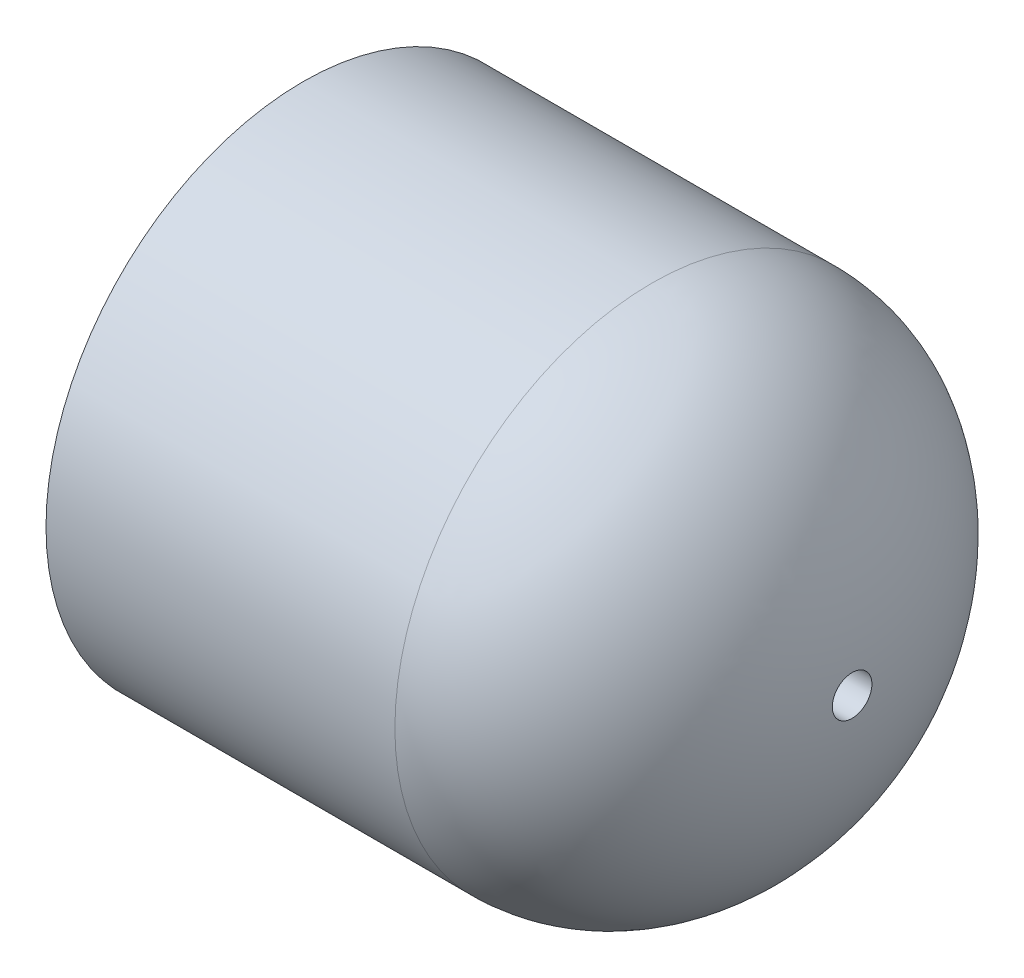
ISO-10303-21;
HEADER;
FILE_DESCRIPTION(('STEP AP214'),'2;1');
FILE_NAME('part.step','',(''),(''),'','','');
FILE_SCHEMA(('AUTOMOTIVE_DESIGN { 1 0 10303 214 1 1 1 1 }'));
ENDSEC;
DATA;
#1=APPLICATION_CONTEXT('core data for automotive mechanical design processes');
#2=APPLICATION_PROTOCOL_DEFINITION('international standard','automotive_design',2000,#1);
#3=PRODUCT_CONTEXT('',#1,'mechanical');
#4=PRODUCT('Part','Part','',(#3));
#5=PRODUCT_RELATED_PRODUCT_CATEGORY('part','',(#4));
#6=PRODUCT_DEFINITION_FORMATION('','',#4);
#7=PRODUCT_DEFINITION_CONTEXT('part definition',#1,'design');
#8=PRODUCT_DEFINITION('design','',#6,#7);
#9=PRODUCT_DEFINITION_SHAPE('','',#8);
#10=(LENGTH_UNIT() NAMED_UNIT(*) SI_UNIT(.MILLI.,.METRE.));
#11=(NAMED_UNIT(*) PLANE_ANGLE_UNIT() SI_UNIT($,.RADIAN.));
#12=(NAMED_UNIT(*) SI_UNIT($,.STERADIAN.) SOLID_ANGLE_UNIT());
#13=UNCERTAINTY_MEASURE_WITH_UNIT(LENGTH_MEASURE(1.E-05),#10,'distance_accuracy_value','');
#14=(GEOMETRIC_REPRESENTATION_CONTEXT(3) GLOBAL_UNCERTAINTY_ASSIGNED_CONTEXT((#13)) GLOBAL_UNIT_ASSIGNED_CONTEXT((#10,
#11,#12)) REPRESENTATION_CONTEXT('',''));
#15=CARTESIAN_POINT('',(0.,0.,0.));
#16=DIRECTION('',(0.,0.,1.));
#17=DIRECTION('',(1.,0.,0.));
#18=AXIS2_PLACEMENT_3D('',#15,#16,#17);
#19=CARTESIAN_POINT('',(-22.0091,0.,0.));
#20=DIRECTION('',(-1.,0.,0.));
#21=DIRECTION('',(0.,0.,1.00000000000001));
#22=AXIS2_PLACEMENT_3D('',#19,#20,#21);
#23=CYLINDRICAL_SURFACE('',#22,20.5867);
#24=CARTESIAN_POINT('',(5.9309,0.,0.));
#25=DIRECTION('',(-1.,0.,0.));
#26=DIRECTION('',(0.,0.,1.00000000000001));
#27=AXIS2_PLACEMENT_3D('',#24,#25,#26);
#28=CIRCLE('',#27,20.5867);
#29=CARTESIAN_POINT('',(5.9309,0.,20.5867000000002));
#30=VERTEX_POINT('',#29);
#31=EDGE_CURVE('E10',#30,#30,#28,.T.);
#32=ORIENTED_EDGE('',*,*,#31,.T.);
#33=EDGE_LOOP('',(#32));
#34=FACE_BOUND('',#33,.T.);
#35=CARTESIAN_POINT('',(-22.0091,0.,0.));
#36=DIRECTION('',(-1.,0.,0.));
#37=DIRECTION('',(0.,0.,1.00000000000001));
#38=AXIS2_PLACEMENT_3D('',#35,#36,#37);
#39=CIRCLE('',#38,20.5867);
#40=CARTESIAN_POINT('',(-22.0091,0.,20.5867000000002));
#41=VERTEX_POINT('',#40);
#42=EDGE_CURVE('E48',#41,#41,#39,.T.);
#43=ORIENTED_EDGE('',*,*,#42,.F.);
#44=EDGE_LOOP('',(#43));
#45=FACE_BOUND('',#44,.T.);
#46=ADVANCED_FACE('F32',(#34,#45),#23,.T.);
#47=CARTESIAN_POINT('',(5.9309,0.,0.));
#48=DIRECTION('',(0.,0.,1.00000000000001));
#49=DIRECTION('',(0.,1.00000000000001,0.));
#50=AXIS2_PLACEMENT_3D('',#47,#48,#49);
#51=ELLIPSE('',#50,20.5867,16.0782);
#52=TRIMMED_CURVE('',#51,(PARAMETER_VALUE(1.5707963267949)),(PARAMETER_VALUE(4.71238898038469)),
.T.,.PARAMETER.);
#53=CARTESIAN_POINT('',(-22.0091,0.,0.));
#54=DIRECTION('',(-1.,0.,0.));
#55=AXIS1_PLACEMENT('',#53,#54);
#56=SURFACE_OF_REVOLUTION('',#52,#55);
#57=CARTESIAN_POINT('',(21.9612250323261,0.,0.));
#58=DIRECTION('',(-1.,0.,0.));
#59=DIRECTION('',(0.,0.,1.00000000000001));
#60=AXIS2_PLACEMENT_3D('',#57,#58,#59);
#61=CIRCLE('',#60,1.5875);
#62=CARTESIAN_POINT('',(21.9612250323261,0.,1.58750000000001));
#63=VERTEX_POINT('',#62);
#64=EDGE_CURVE('E51',#63,#63,#61,.F.);
#65=ORIENTED_EDGE('',*,*,#64,.F.);
#66=EDGE_LOOP('',(#65));
#67=FACE_BOUND('',#66,.T.);
#68=ORIENTED_EDGE('',*,*,#31,.F.);
#69=EDGE_LOOP('',(#68));
#70=FACE_BOUND('',#69,.T.);
#71=ADVANCED_FACE('F61',(#67,#70),#56,.F.);
#72=CARTESIAN_POINT('',(5.9309,0.,0.));
#73=DIRECTION('',(0.,0.,-1.00000000000001));
#74=DIRECTION('',(0.,-1.00000000000001,0.));
#75=AXIS2_PLACEMENT_3D('',#72,#73,#74);
#76=ELLIPSE('',#75,16.637,12.1285);
#77=TRIMMED_CURVE('',#76,(PARAMETER_VALUE(4.71238898038469)),
(PARAMETER_VALUE(7.85398163397448)),.T.,.PARAMETER.);
#78=CARTESIAN_POINT('',(-22.0091,0.,0.));
#79=DIRECTION('',(-1.,0.,0.));
#80=AXIS1_PLACEMENT('',#78,#79);
#81=SURFACE_OF_REVOLUTION('',#77,#80);
#82=CARTESIAN_POINT('',(18.0040590664347,0.,0.));
#83=DIRECTION('',(-1.,0.,0.));
#84=DIRECTION('',(0.,0.,1.00000000000001));
#85=AXIS2_PLACEMENT_3D('',#82,#83,#84);
#86=CIRCLE('',#85,1.5875);
#87=CARTESIAN_POINT('',(18.0040590664347,0.,1.58750000000001));
#88=VERTEX_POINT('',#87);
#89=EDGE_CURVE('E35',#88,#88,#86,.T.);
#90=ORIENTED_EDGE('',*,*,#89,.F.);
#91=EDGE_LOOP('',(#90));
#92=FACE_BOUND('',#91,.T.);
#93=CARTESIAN_POINT('',(5.9309,0.,0.));
#94=DIRECTION('',(-1.,0.,0.));
#95=DIRECTION('',(0.,0.,1.00000000000001));
#96=AXIS2_PLACEMENT_3D('',#93,#94,#95);
#97=CIRCLE('',#96,16.637);
#98=CARTESIAN_POINT('',(5.9309,0.,16.6370000000001));
#99=VERTEX_POINT('',#98);
#100=EDGE_CURVE('E39',#99,#99,#97,.T.);
#101=ORIENTED_EDGE('',*,*,#100,.T.);
#102=EDGE_LOOP('',(#101));
#103=FACE_BOUND('',#102,.T.);
#104=ADVANCED_FACE('F57',(#92,#103),#81,.F.);
#105=CARTESIAN_POINT('',(5.9309,0.,0.));
#106=DIRECTION('',(-1.,0.,0.));
#107=DIRECTION('',(0.,0.,1.00000000000001));
#108=AXIS2_PLACEMENT_3D('',#105,#106,#107);
#109=CONICAL_SURFACE('',#108,16.637,0.00681807616748478);
#110=CARTESIAN_POINT('',(-22.0091,0.,0.));
#111=DIRECTION('',(-1.,0.,0.));
#112=DIRECTION('',(0.,0.,1.00000000000001));
#113=AXIS2_PLACEMENT_3D('',#110,#111,#112);
#114=CIRCLE('',#113,16.8275);
#115=CARTESIAN_POINT('',(-22.0091,0.,16.8275000000001));
#116=VERTEX_POINT('',#115);
#117=EDGE_CURVE('E43',#116,#116,#114,.T.);
#118=ORIENTED_EDGE('',*,*,#117,.T.);
#119=EDGE_LOOP('',(#118));
#120=FACE_BOUND('',#119,.T.);
#121=ORIENTED_EDGE('',*,*,#100,.F.);
#122=EDGE_LOOP('',(#121));
#123=FACE_BOUND('',#122,.T.);
#124=ADVANCED_FACE('F60',(#120,#123),#109,.F.);
#125=CARTESIAN_POINT('',(-22.0091,-20.5867000000001,0.));
#126=DIRECTION('',(-1.,0.,0.));
#127=DIRECTION('',(0.,0.,1.00000000000001));
#128=AXIS2_PLACEMENT_3D('',#125,#126,#127);
#129=PLANE('',#128);
#130=ORIENTED_EDGE('',*,*,#42,.T.);
#131=EDGE_LOOP('',(#130));
#132=FACE_BOUND('',#131,.T.);
#133=ORIENTED_EDGE('',*,*,#117,.F.);
#134=EDGE_LOOP('',(#133));
#135=FACE_BOUND('',#134,.T.);
#136=ADVANCED_FACE('F81',(#132,#135),#129,.T.);
#137=CARTESIAN_POINT('',(-25.4,0.,0.));
#138=DIRECTION('',(1.,0.,0.));
#139=DIRECTION('',(0.,0.,-1.00000000000001));
#140=AXIS2_PLACEMENT_3D('',#137,#138,#139);
#141=CYLINDRICAL_SURFACE('',#140,1.5875);
#142=ORIENTED_EDGE('',*,*,#64,.T.);
#143=EDGE_LOOP('',(#142));
#144=FACE_BOUND('',#143,.T.);
#145=ORIENTED_EDGE('',*,*,#89,.T.);
#146=EDGE_LOOP('',(#145));
#147=FACE_BOUND('',#146,.T.);
#148=ADVANCED_FACE('F76',(#144,#147),#141,.F.);
#149=CLOSED_SHELL('',(#46,#71,#104,#124,#136,#148));
#150=MANIFOLD_SOLID_BREP('B2',#149);
#151=ADVANCED_BREP_SHAPE_REPRESENTATION('',(#18,#150),#14);
#152=SHAPE_DEFINITION_REPRESENTATION(#9,#151);
ENDSEC;
END-ISO-10303-21;
